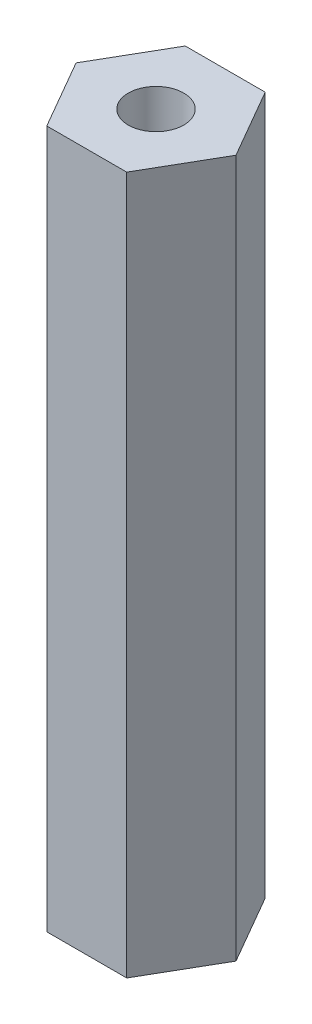
ISO-10303-21;
HEADER;
FILE_DESCRIPTION(('STEP AP214'),'2;1');
FILE_NAME('part.step','',(''),(''),'','','');
FILE_SCHEMA(('AUTOMOTIVE_DESIGN { 1 0 10303 214 1 1 1 1 }'));
ENDSEC;
DATA;
#1=APPLICATION_CONTEXT('core data for automotive mechanical design processes');
#2=APPLICATION_PROTOCOL_DEFINITION('international standard','automotive_design',2000,#1);
#3=PRODUCT_CONTEXT('',#1,'mechanical');
#4=PRODUCT('Part','Part','',(#3));
#5=PRODUCT_RELATED_PRODUCT_CATEGORY('part','',(#4));
#6=PRODUCT_DEFINITION_FORMATION('','',#4);
#7=PRODUCT_DEFINITION_CONTEXT('part definition',#1,'design');
#8=PRODUCT_DEFINITION('design','',#6,#7);
#9=PRODUCT_DEFINITION_SHAPE('','',#8);
#10=(LENGTH_UNIT() NAMED_UNIT(*) SI_UNIT(.MILLI.,.METRE.));
#11=(NAMED_UNIT(*) PLANE_ANGLE_UNIT() SI_UNIT($,.RADIAN.));
#12=(NAMED_UNIT(*) SI_UNIT($,.STERADIAN.) SOLID_ANGLE_UNIT());
#13=UNCERTAINTY_MEASURE_WITH_UNIT(LENGTH_MEASURE(1.E-05),#10,'distance_accuracy_value','');
#14=(GEOMETRIC_REPRESENTATION_CONTEXT(3) GLOBAL_UNCERTAINTY_ASSIGNED_CONTEXT((#13)) GLOBAL_UNIT_ASSIGNED_CONTEXT((#10,
#11,#12)) REPRESENTATION_CONTEXT('',''));
#15=CARTESIAN_POINT('',(0.,0.,0.));
#16=DIRECTION('',(0.,0.,1.));
#17=DIRECTION('',(1.,0.,0.));
#18=AXIS2_PLACEMENT_3D('',#15,#16,#17);
#19=CARTESIAN_POINT('',(-2.05305755723831,46.7037594475086,3.556));
#20=DIRECTION('',(0.,0.,-1.));
#21=DIRECTION('',(-1.,0.,0.));
#22=AXIS2_PLACEMENT_3D('',#19,#20,#21);
#23=PLANE('',#22);
#24=DIRECTION('',(1.,0.,0.));
#25=VECTOR('',#24,1.);
#26=CARTESIAN_POINT('',(-2.05305755723831,35.84,3.556));
#27=LINE('',#26,#25);
#28=CARTESIAN_POINT('',(-2.05305755723831,35.84,3.556));
#29=VERTEX_POINT('',#28);
#30=CARTESIAN_POINT('',(2.05305755723831,35.84,3.556));
#31=VERTEX_POINT('',#30);
#32=EDGE_CURVE('E88',#29,#31,#27,.T.);
#33=ORIENTED_EDGE('',*,*,#32,.F.);
#34=DIRECTION('',(0.,-1.,0.));
#35=VECTOR('',#34,1.);
#36=CARTESIAN_POINT('',(-2.05305755723831,46.7037594475086,3.556));
#37=LINE('',#36,#35);
#38=CARTESIAN_POINT('',(-2.05305755723831,0.,3.556));
#39=VERTEX_POINT('',#38);
#40=EDGE_CURVE('E48',#29,#39,#37,.T.);
#41=ORIENTED_EDGE('',*,*,#40,.T.);
#42=DIRECTION('',(1.,0.,0.));
#43=VECTOR('',#42,1.);
#44=CARTESIAN_POINT('',(-2.05305755723831,0.,3.556));
#45=LINE('',#44,#43);
#46=CARTESIAN_POINT('',(2.05305755723831,0.,3.556));
#47=VERTEX_POINT('',#46);
#48=EDGE_CURVE('E91',#39,#47,#45,.T.);
#49=ORIENTED_EDGE('',*,*,#48,.T.);
#50=DIRECTION('',(0.,-1.,0.));
#51=VECTOR('',#50,1.);
#52=CARTESIAN_POINT('',(2.05305755723831,46.7037594475086,3.556));
#53=LINE('',#52,#51);
#54=EDGE_CURVE('E85',#31,#47,#53,.T.);
#55=ORIENTED_EDGE('',*,*,#54,.F.);
#56=EDGE_LOOP('',(#33,#41,#49,#55));
#57=FACE_BOUND('',#56,.T.);
#58=ADVANCED_FACE('F32',(#57),#23,.F.);
#59=CARTESIAN_POINT('',(-4.10611511447662,46.7037594475086,0.));
#60=DIRECTION('',(0.866025403784438,0.,-0.5));
#61=DIRECTION('',(-0.5,0.,-0.866025403784439));
#62=AXIS2_PLACEMENT_3D('',#59,#60,#61);
#63=PLANE('',#62);
#64=DIRECTION('',(0.5,0.,0.866025403784439));
#65=VECTOR('',#64,1.);
#66=CARTESIAN_POINT('',(-4.10611511447662,35.84,0.));
#67=LINE('',#66,#65);
#68=CARTESIAN_POINT('',(-4.10611511447662,35.84,0.));
#69=VERTEX_POINT('',#68);
#70=EDGE_CURVE('E103',#69,#29,#67,.T.);
#71=ORIENTED_EDGE('',*,*,#70,.F.);
#72=DIRECTION('',(0.,-1.,0.));
#73=VECTOR('',#72,1.);
#74=CARTESIAN_POINT('',(-4.10611511447662,46.7037594475086,0.));
#75=LINE('',#74,#73);
#76=CARTESIAN_POINT('',(-4.10611511447662,0.,0.));
#77=VERTEX_POINT('',#76);
#78=EDGE_CURVE('E131',#69,#77,#75,.T.);
#79=ORIENTED_EDGE('',*,*,#78,.T.);
#80=DIRECTION('',(0.5,0.,0.866025403784439));
#81=VECTOR('',#80,1.);
#82=CARTESIAN_POINT('',(-4.10611511447662,0.,0.));
#83=LINE('',#82,#81);
#84=EDGE_CURVE('E127',#77,#39,#83,.T.);
#85=ORIENTED_EDGE('',*,*,#84,.T.);
#86=ORIENTED_EDGE('',*,*,#40,.F.);
#87=EDGE_LOOP('',(#71,#79,#85,#86));
#88=FACE_BOUND('',#87,.T.);
#89=ADVANCED_FACE('F149',(#88),#63,.F.);
#90=CARTESIAN_POINT('',(-2.05305755723831,46.7037594475086,-3.556));
#91=DIRECTION('',(0.866025403784439,0.,0.5));
#92=DIRECTION('',(0.5,0.,-0.866025403784439));
#93=AXIS2_PLACEMENT_3D('',#90,#91,#92);
#94=PLANE('',#93);
#95=DIRECTION('',(-0.5,0.,0.866025403784439));
#96=VECTOR('',#95,1.);
#97=CARTESIAN_POINT('',(-2.05305755723831,35.84,-3.556));
#98=LINE('',#97,#96);
#99=CARTESIAN_POINT('',(-2.05305755723831,35.84,-3.556));
#100=VERTEX_POINT('',#99);
#101=EDGE_CURVE('E105',#100,#69,#98,.T.);
#102=ORIENTED_EDGE('',*,*,#101,.F.);
#103=DIRECTION('',(0.,-1.,0.));
#104=VECTOR('',#103,1.);
#105=CARTESIAN_POINT('',(-2.05305755723831,46.7037594475086,-3.556));
#106=LINE('',#105,#104);
#107=CARTESIAN_POINT('',(-2.05305755723831,0.,-3.556));
#108=VERTEX_POINT('',#107);
#109=EDGE_CURVE('E133',#100,#108,#106,.T.);
#110=ORIENTED_EDGE('',*,*,#109,.T.);
#111=DIRECTION('',(-0.5,0.,0.866025403784439));
#112=VECTOR('',#111,1.);
#113=CARTESIAN_POINT('',(-2.05305755723831,0.,-3.556));
#114=LINE('',#113,#112);
#115=EDGE_CURVE('E124',#108,#77,#114,.T.);
#116=ORIENTED_EDGE('',*,*,#115,.T.);
#117=ORIENTED_EDGE('',*,*,#78,.F.);
#118=EDGE_LOOP('',(#102,#110,#116,#117));
#119=FACE_BOUND('',#118,.T.);
#120=ADVANCED_FACE('F148',(#119),#94,.F.);
#121=CARTESIAN_POINT('',(2.05305755723831,46.7037594475086,-3.556));
#122=DIRECTION('',(0.,0.,1.));
#123=DIRECTION('',(1.,0.,0.));
#124=AXIS2_PLACEMENT_3D('',#121,#122,#123);
#125=PLANE('',#124);
#126=DIRECTION('',(-1.,0.,0.));
#127=VECTOR('',#126,1.);
#128=CARTESIAN_POINT('',(2.05305755723831,35.84,-3.556));
#129=LINE('',#128,#127);
#130=CARTESIAN_POINT('',(2.05305755723831,35.84,-3.556));
#131=VERTEX_POINT('',#130);
#132=EDGE_CURVE('E110',#131,#100,#129,.T.);
#133=ORIENTED_EDGE('',*,*,#132,.F.);
#134=DIRECTION('',(0.,-1.,0.));
#135=VECTOR('',#134,1.);
#136=CARTESIAN_POINT('',(2.05305755723831,46.7037594475086,-3.556));
#137=LINE('',#136,#135);
#138=CARTESIAN_POINT('',(2.05305755723831,0.,-3.556));
#139=VERTEX_POINT('',#138);
#140=EDGE_CURVE('E41',#131,#139,#137,.T.);
#141=ORIENTED_EDGE('',*,*,#140,.T.);
#142=DIRECTION('',(-1.,0.,0.));
#143=VECTOR('',#142,1.);
#144=CARTESIAN_POINT('',(2.05305755723831,0.,-3.556));
#145=LINE('',#144,#143);
#146=EDGE_CURVE('E121',#139,#108,#145,.T.);
#147=ORIENTED_EDGE('',*,*,#146,.T.);
#148=ORIENTED_EDGE('',*,*,#109,.F.);
#149=EDGE_LOOP('',(#133,#141,#147,#148));
#150=FACE_BOUND('',#149,.T.);
#151=ADVANCED_FACE('F136',(#150),#125,.F.);
#152=CARTESIAN_POINT('',(4.10611511447662,46.7037594475086,0.));
#153=DIRECTION('',(-0.866025403784438,0.,0.5));
#154=DIRECTION('',(0.5,0.,0.866025403784439));
#155=AXIS2_PLACEMENT_3D('',#152,#153,#154);
#156=PLANE('',#155);
#157=DIRECTION('',(-0.5,0.,-0.866025403784439));
#158=VECTOR('',#157,1.);
#159=CARTESIAN_POINT('',(4.10611511447662,35.84,0.));
#160=LINE('',#159,#158);
#161=CARTESIAN_POINT('',(4.10611511447662,35.84,0.));
#162=VERTEX_POINT('',#161);
#163=EDGE_CURVE('E55',#162,#131,#160,.T.);
#164=ORIENTED_EDGE('',*,*,#163,.F.);
#165=DIRECTION('',(0.,-1.,0.));
#166=VECTOR('',#165,1.);
#167=CARTESIAN_POINT('',(4.10611511447662,46.7037594475086,0.));
#168=LINE('',#167,#166);
#169=CARTESIAN_POINT('',(4.10611511447662,0.,0.));
#170=VERTEX_POINT('',#169);
#171=EDGE_CURVE('E11',#162,#170,#168,.T.);
#172=ORIENTED_EDGE('',*,*,#171,.T.);
#173=DIRECTION('',(-0.5,0.,-0.866025403784439));
#174=VECTOR('',#173,1.);
#175=CARTESIAN_POINT('',(4.10611511447662,0.,0.));
#176=LINE('',#175,#174);
#177=EDGE_CURVE('E118',#170,#139,#176,.T.);
#178=ORIENTED_EDGE('',*,*,#177,.T.);
#179=ORIENTED_EDGE('',*,*,#140,.F.);
#180=EDGE_LOOP('',(#164,#172,#178,#179));
#181=FACE_BOUND('',#180,.T.);
#182=ADVANCED_FACE('F141',(#181),#156,.F.);
#183=CARTESIAN_POINT('',(2.05305755723831,46.7037594475086,3.556));
#184=DIRECTION('',(-0.866025403784439,0.,-0.5));
#185=DIRECTION('',(-0.5,0.,0.866025403784439));
#186=AXIS2_PLACEMENT_3D('',#183,#184,#185);
#187=PLANE('',#186);
#188=DIRECTION('',(0.5,0.,-0.866025403784439));
#189=VECTOR('',#188,1.);
#190=CARTESIAN_POINT('',(2.05305755723831,35.84,3.556));
#191=LINE('',#190,#189);
#192=EDGE_CURVE('E97',#31,#162,#191,.T.);
#193=ORIENTED_EDGE('',*,*,#192,.F.);
#194=ORIENTED_EDGE('',*,*,#54,.T.);
#195=DIRECTION('',(0.5,0.,-0.866025403784439));
#196=VECTOR('',#195,1.);
#197=CARTESIAN_POINT('',(2.05305755723831,0.,3.556));
#198=LINE('',#197,#196);
#199=EDGE_CURVE('E116',#47,#170,#198,.T.);
#200=ORIENTED_EDGE('',*,*,#199,.T.);
#201=ORIENTED_EDGE('',*,*,#171,.F.);
#202=EDGE_LOOP('',(#193,#194,#200,#201));
#203=FACE_BOUND('',#202,.T.);
#204=ADVANCED_FACE('F34',(#203),#187,.F.);
#205=CARTESIAN_POINT('',(0.,0.,0.));
#206=DIRECTION('',(0.,1.,0.));
#207=DIRECTION('',(0.,0.,1.));
#208=AXIS2_PLACEMENT_3D('',#205,#206,#207);
#209=PLANE('',#208);
#210=ORIENTED_EDGE('',*,*,#199,.F.);
#211=ORIENTED_EDGE('',*,*,#48,.F.);
#212=ORIENTED_EDGE('',*,*,#84,.F.);
#213=ORIENTED_EDGE('',*,*,#115,.F.);
#214=ORIENTED_EDGE('',*,*,#146,.F.);
#215=ORIENTED_EDGE('',*,*,#177,.F.);
#216=EDGE_LOOP('',(#210,#211,#212,#213,#214,#215));
#217=FACE_BOUND('',#216,.T.);
#218=CARTESIAN_POINT('',(0.,0.,0.));
#219=DIRECTION('',(0.,1.,0.));
#220=DIRECTION('',(0.,0.,1.));
#221=AXIS2_PLACEMENT_3D('',#218,#219,#220);
#222=CIRCLE('',#221,1.425);
#223=CARTESIAN_POINT('',(0.,0.,1.425));
#224=VERTEX_POINT('',#223);
#225=EDGE_CURVE('E99',#224,#224,#222,.T.);
#226=ORIENTED_EDGE('',*,*,#225,.T.);
#227=EDGE_LOOP('',(#226));
#228=FACE_BOUND('',#227,.T.);
#229=ADVANCED_FACE('F143',(#217,#228),#209,.F.);
#230=CARTESIAN_POINT('',(0.,46.7037594475086,0.));
#231=DIRECTION('',(0.,-1.,0.));
#232=DIRECTION('',(0.,0.,-1.));
#233=AXIS2_PLACEMENT_3D('',#230,#231,#232);
#234=CYLINDRICAL_SURFACE('',#233,1.425);
#235=ORIENTED_EDGE('',*,*,#225,.F.);
#236=EDGE_LOOP('',(#235));
#237=FACE_BOUND('',#236,.T.);
#238=CARTESIAN_POINT('',(0.,35.84,0.));
#239=DIRECTION('',(0.,1.,0.));
#240=DIRECTION('',(0.,0.,1.));
#241=AXIS2_PLACEMENT_3D('',#238,#239,#240);
#242=CIRCLE('',#241,1.425);
#243=CARTESIAN_POINT('',(0.,35.84,1.425));
#244=VERTEX_POINT('',#243);
#245=EDGE_CURVE('E36',#244,#244,#242,.T.);
#246=ORIENTED_EDGE('',*,*,#245,.T.);
#247=EDGE_LOOP('',(#246));
#248=FACE_BOUND('',#247,.T.);
#249=ADVANCED_FACE('F168',(#237,#248),#234,.F.);
#250=CARTESIAN_POINT('',(-7.24999999999995,35.84,-26.3903810567666));
#251=DIRECTION('',(0.,1.,0.));
#252=DIRECTION('',(0.,0.,1.));
#253=AXIS2_PLACEMENT_3D('',#250,#251,#252);
#254=PLANE('',#253);
#255=ORIENTED_EDGE('',*,*,#245,.F.);
#256=EDGE_LOOP('',(#255));
#257=FACE_BOUND('',#256,.T.);
#258=ORIENTED_EDGE('',*,*,#32,.T.);
#259=ORIENTED_EDGE('',*,*,#192,.T.);
#260=ORIENTED_EDGE('',*,*,#163,.T.);
#261=ORIENTED_EDGE('',*,*,#132,.T.);
#262=ORIENTED_EDGE('',*,*,#101,.T.);
#263=ORIENTED_EDGE('',*,*,#70,.T.);
#264=EDGE_LOOP('',(#258,#259,#260,#261,#262,#263));
#265=FACE_BOUND('',#264,.T.);
#266=ADVANCED_FACE('F101',(#257,#265),#254,.T.);
#267=CLOSED_SHELL('',(#58,#89,#120,#151,#182,#204,#229,#249,#266));
#268=MANIFOLD_SOLID_BREP('B2',#267);
#269=ADVANCED_BREP_SHAPE_REPRESENTATION('',(#18,#268),#14);
#270=SHAPE_DEFINITION_REPRESENTATION(#9,#269);
ENDSEC;
END-ISO-10303-21;
